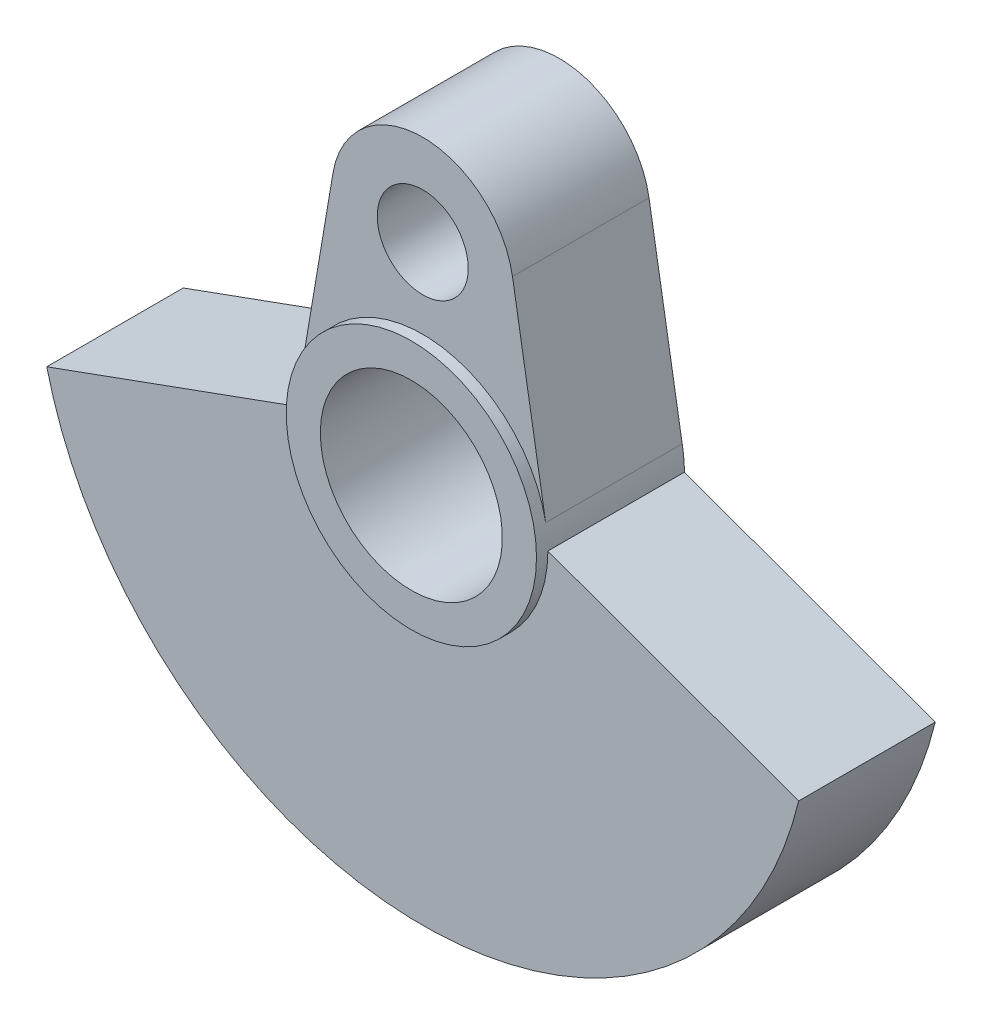
ISO-10303-21;
HEADER;
FILE_DESCRIPTION(('STEP AP214'),'2;1');
FILE_NAME('part.step','',(''),(''),'','','');
FILE_SCHEMA(('AUTOMOTIVE_DESIGN { 1 0 10303 214 1 1 1 1 }'));
ENDSEC;
DATA;
#1=APPLICATION_CONTEXT('core data for automotive mechanical design processes');
#2=APPLICATION_PROTOCOL_DEFINITION('international standard','automotive_design',2000,#1);
#3=PRODUCT_CONTEXT('',#1,'mechanical');
#4=PRODUCT('Part','Part','',(#3));
#5=PRODUCT_RELATED_PRODUCT_CATEGORY('part','',(#4));
#6=PRODUCT_DEFINITION_FORMATION('','',#4);
#7=PRODUCT_DEFINITION_CONTEXT('part definition',#1,'design');
#8=PRODUCT_DEFINITION('design','',#6,#7);
#9=PRODUCT_DEFINITION_SHAPE('','',#8);
#10=(LENGTH_UNIT() NAMED_UNIT(*) SI_UNIT(.MILLI.,.METRE.));
#11=(NAMED_UNIT(*) PLANE_ANGLE_UNIT() SI_UNIT($,.RADIAN.));
#12=(NAMED_UNIT(*) SI_UNIT($,.STERADIAN.) SOLID_ANGLE_UNIT());
#13=UNCERTAINTY_MEASURE_WITH_UNIT(LENGTH_MEASURE(1.E-05),#10,'distance_accuracy_value','');
#14=(GEOMETRIC_REPRESENTATION_CONTEXT(3) GLOBAL_UNCERTAINTY_ASSIGNED_CONTEXT((#13)) GLOBAL_UNIT_ASSIGNED_CONTEXT((#10,
#11,#12)) REPRESENTATION_CONTEXT('',''));
#15=CARTESIAN_POINT('',(0.,0.,0.));
#16=DIRECTION('',(0.,0.,1.));
#17=DIRECTION('',(1.,0.,0.));
#18=AXIS2_PLACEMENT_3D('',#15,#16,#17);
#19=CARTESIAN_POINT('',(2.91143017976683E-05,2.92052455162969,4.48682204607331));
#20=DIRECTION('',(0.,0.,-1.));
#21=DIRECTION('',(-1.,0.,0.));
#22=AXIS2_PLACEMENT_3D('',#19,#20,#21);
#23=CYLINDRICAL_SURFACE('',#22,25.5);
#24=CARTESIAN_POINT('',(2.91143017976683E-05,2.92052455162969,-4.51317795392669));
#25=DIRECTION('',(0.,0.,1.));
#26=DIRECTION('',(1.,0.,0.));
#27=AXIS2_PLACEMENT_3D('',#24,#25,#26);
#28=CIRCLE('',#27,25.5);
#29=CARTESIAN_POINT('',(24.7840965770893,-3.07947544837031,-4.51317795392669));
#30=VERTEX_POINT('',#29);
#31=CARTESIAN_POINT('',(-24.7840383484857,-3.07947544837031,-4.51317795392669));
#32=VERTEX_POINT('',#31);
#33=EDGE_CURVE('E158',#30,#32,#28,.F.);
#34=ORIENTED_EDGE('',*,*,#33,.F.);
#35=DIRECTION('',(0.,0.,-1.));
#36=VECTOR('',#35,1.);
#37=CARTESIAN_POINT('',(24.7840965770893,-3.07947544837031,4.48682204607331));
#38=LINE('',#37,#36);
#39=CARTESIAN_POINT('',(24.7840965770893,-3.07947544837031,4.48682204607331));
#40=VERTEX_POINT('',#39);
#41=EDGE_CURVE('E12',#40,#30,#38,.T.);
#42=ORIENTED_EDGE('',*,*,#41,.F.);
#43=CARTESIAN_POINT('',(2.91143017976683E-05,2.92052455162969,4.48682204607331));
#44=DIRECTION('',(0.,0.,1.));
#45=DIRECTION('',(1.,0.,0.));
#46=AXIS2_PLACEMENT_3D('',#43,#44,#45);
#47=CIRCLE('',#46,25.5);
#48=CARTESIAN_POINT('',(-24.7840383484857,-3.07947544837031,4.48682204607331));
#49=VERTEX_POINT('',#48);
#50=EDGE_CURVE('E161',#40,#49,#47,.F.);
#51=ORIENTED_EDGE('',*,*,#50,.T.);
#52=DIRECTION('',(0.,0.,-1.));
#53=VECTOR('',#52,1.);
#54=CARTESIAN_POINT('',(-24.7840383484857,-3.07947544837031,4.48682204607331));
#55=LINE('',#54,#53);
#56=EDGE_CURVE('E173',#49,#32,#55,.T.);
#57=ORIENTED_EDGE('',*,*,#56,.T.);
#58=EDGE_LOOP('',(#34,#42,#51,#57));
#59=FACE_BOUND('',#58,.T.);
#60=ADVANCED_FACE('F45',(#59),#23,.T.);
#61=CARTESIAN_POINT('',(0.960027913852562,5.56597203762425,4.48682204607331));
#62=DIRECTION('',(-0.341120932888379,-0.940019419557576,0.));
#63=DIRECTION('',(0.940019419557576,-0.341120932888379,0.));
#64=AXIS2_PLACEMENT_3D('',#61,#62,#63);
#65=PLANE('',#64);
#66=DIRECTION('',(-0.940019419557576,0.341120932888379,0.));
#67=VECTOR('',#66,1.);
#68=CARTESIAN_POINT('',(0.960027913852562,5.56597203762425,-4.51317795392669));
#69=LINE('',#68,#67);
#70=CARTESIAN_POINT('',(8.2500291143018,2.92052455162969,-4.51317795392669));
#71=VERTEX_POINT('',#70);
#72=EDGE_CURVE('E176',#30,#71,#69,.T.);
#73=ORIENTED_EDGE('',*,*,#72,.T.);
#74=DIRECTION('',(0.,0.,-1.));
#75=VECTOR('',#74,1.);
#76=CARTESIAN_POINT('',(8.2500291143018,2.92052455162969,4.48682204607331));
#77=LINE('',#76,#75);
#78=CARTESIAN_POINT('',(8.2500291143018,2.92052455162969,4.48682204607331));
#79=VERTEX_POINT('',#78);
#80=EDGE_CURVE('E52',#79,#71,#77,.T.);
#81=ORIENTED_EDGE('',*,*,#80,.F.);
#82=DIRECTION('',(-0.940019419557576,0.341120932888379,0.));
#83=VECTOR('',#82,1.);
#84=CARTESIAN_POINT('',(0.960027913852562,5.56597203762425,4.48682204607331));
#85=LINE('',#84,#83);
#86=EDGE_CURVE('E164',#40,#79,#85,.T.);
#87=ORIENTED_EDGE('',*,*,#86,.F.);
#88=ORIENTED_EDGE('',*,*,#41,.T.);
#89=EDGE_LOOP('',(#73,#81,#87,#88));
#90=FACE_BOUND('',#89,.T.);
#91=ADVANCED_FACE('F192',(#90),#65,.F.);
#92=CARTESIAN_POINT('',(-0.959969685248967,5.56597203762425,4.48682204607331));
#93=DIRECTION('',(-0.341120932888379,0.940019419557576,0.));
#94=DIRECTION('',(-0.940019419557576,-0.341120932888379,0.));
#95=AXIS2_PLACEMENT_3D('',#92,#93,#94);
#96=PLANE('',#95);
#97=DIRECTION('',(0.940019419557576,0.341120932888379,0.));
#98=VECTOR('',#97,1.);
#99=CARTESIAN_POINT('',(-0.959969685248967,5.56597203762425,-4.51317795392669));
#100=LINE('',#99,#98);
#101=CARTESIAN_POINT('',(-8.2499708856982,2.92052455162969,-4.51317795392669));
#102=VERTEX_POINT('',#101);
#103=EDGE_CURVE('E165',#32,#102,#100,.T.);
#104=ORIENTED_EDGE('',*,*,#103,.F.);
#105=ORIENTED_EDGE('',*,*,#56,.F.);
#106=DIRECTION('',(0.940019419557576,0.341120932888379,0.));
#107=VECTOR('',#106,1.);
#108=CARTESIAN_POINT('',(-0.959969685248967,5.56597203762425,4.48682204607331));
#109=LINE('',#108,#107);
#110=CARTESIAN_POINT('',(-8.2499708856982,2.92052455162969,4.48682204607331));
#111=VERTEX_POINT('',#110);
#112=EDGE_CURVE('E170',#49,#111,#109,.T.);
#113=ORIENTED_EDGE('',*,*,#112,.T.);
#114=DIRECTION('',(0.,0.,-1.));
#115=VECTOR('',#114,1.);
#116=CARTESIAN_POINT('',(-8.2499708856982,2.92052455162969,4.48682204607331));
#117=LINE('',#116,#115);
#118=EDGE_CURVE('E182',#111,#102,#117,.T.);
#119=ORIENTED_EDGE('',*,*,#118,.T.);
#120=EDGE_LOOP('',(#104,#105,#113,#119));
#121=FACE_BOUND('',#120,.T.);
#122=ADVANCED_FACE('F202',(#121),#96,.T.);
#123=CARTESIAN_POINT('',(2.91143017976683E-05,2.92052455162969,4.48682204607331));
#124=DIRECTION('',(0.,0.,1.));
#125=DIRECTION('',(1.,0.,0.));
#126=AXIS2_PLACEMENT_3D('',#123,#124,#125);
#127=PLANE('',#126);
#128=ORIENTED_EDGE('',*,*,#50,.F.);
#129=ORIENTED_EDGE('',*,*,#86,.T.);
#130=CARTESIAN_POINT('',(2.91143017976683E-05,2.92052455162969,4.48682204607331));
#131=DIRECTION('',(0.,0.,1.));
#132=DIRECTION('',(1.,0.,0.));
#133=AXIS2_PLACEMENT_3D('',#130,#131,#132);
#134=CIRCLE('',#133,8.25);
#135=EDGE_CURVE('E168',#111,#79,#134,.T.);
#136=ORIENTED_EDGE('',*,*,#135,.F.);
#137=ORIENTED_EDGE('',*,*,#112,.F.);
#138=EDGE_LOOP('',(#128,#129,#136,#137));
#139=FACE_BOUND('',#138,.T.);
#140=ADVANCED_FACE('F224',(#139),#127,.T.);
#141=CARTESIAN_POINT('',(2.91143017976683E-05,2.92052455162969,-4.51317795392669));
#142=DIRECTION('',(0.,0.,1.));
#143=DIRECTION('',(1.,0.,0.));
#144=AXIS2_PLACEMENT_3D('',#141,#142,#143);
#145=PLANE('',#144);
#146=ORIENTED_EDGE('',*,*,#33,.T.);
#147=ORIENTED_EDGE('',*,*,#103,.T.);
#148=CARTESIAN_POINT('',(2.91143017976683E-05,2.92052455162969,-4.51317795392669));
#149=DIRECTION('',(0.,0.,1.));
#150=DIRECTION('',(1.,0.,0.));
#151=AXIS2_PLACEMENT_3D('',#148,#149,#150);
#152=CIRCLE('',#151,8.25);
#153=CARTESIAN_POINT('',(-8.13458058746017,4.2955245516297,-4.51317795392669));
#154=VERTEX_POINT('',#153);
#155=EDGE_CURVE('E152',#154,#102,#152,.T.);
#156=ORIENTED_EDGE('',*,*,#155,.F.);
#157=DIRECTION('',(-0.166666666666667,-0.986013297183269,0.));
#158=VECTOR('',#157,1.);
#159=CARTESIAN_POINT('',(-8.13458058746017,4.2955245516297,-4.51317795392669));
#160=LINE('',#159,#158);
#161=CARTESIAN_POINT('',(-5.91605066879782,17.4205245516297,-4.51317795392669));
#162=VERTEX_POINT('',#161);
#163=EDGE_CURVE('E132',#162,#154,#160,.T.);
#164=ORIENTED_EDGE('',*,*,#163,.F.);
#165=CARTESIAN_POINT('',(2.91143018030489E-05,16.4205245516297,-4.51317795392669));
#166=DIRECTION('',(0.,0.,1.));
#167=DIRECTION('',(1.,0.,0.));
#168=AXIS2_PLACEMENT_3D('',#165,#166,#167);
#169=CIRCLE('',#168,6.);
#170=CARTESIAN_POINT('',(5.91624954479313,17.4196921140721,-4.51317795392669));
#171=VERTEX_POINT('',#170);
#172=EDGE_CURVE('E141',#171,#162,#169,.T.);
#173=ORIENTED_EDGE('',*,*,#172,.F.);
#174=DIRECTION('',(0.166527927073735,-0.98603673841522,0.));
#175=VECTOR('',#174,1.);
#176=CARTESIAN_POINT('',(8.13298537469537,4.29406804576102,-4.51317795392669));
#177=LINE('',#176,#175);
#178=CARTESIAN_POINT('',(8.10371208776362,4.4673995516297,-4.51317795392669));
#179=VERTEX_POINT('',#178);
#180=EDGE_CURVE('E113',#171,#179,#177,.T.);
#181=ORIENTED_EDGE('',*,*,#180,.T.);
#182=EDGE_CURVE('E159',#71,#179,#152,.T.);
#183=ORIENTED_EDGE('',*,*,#182,.F.);
#184=ORIENTED_EDGE('',*,*,#72,.F.);
#185=EDGE_LOOP('',(#146,#147,#156,#164,#173,#181,#183,#184));
#186=FACE_BOUND('',#185,.T.);
#187=CARTESIAN_POINT('',(2.91143017976683E-05,2.92052455162969,-4.51317795392669));
#188=DIRECTION('',(0.,0.,1.));
#189=DIRECTION('',(1.,0.,0.));
#190=AXIS2_PLACEMENT_3D('',#187,#188,#189);
#191=CIRCLE('',#190,6.);
#192=CARTESIAN_POINT('',(-5.9999708856982,2.92052455162969,-4.51317795392669));
#193=VERTEX_POINT('',#192);
#194=EDGE_CURVE('E117',#193,#193,#191,.T.);
#195=ORIENTED_EDGE('',*,*,#194,.T.);
#196=EDGE_LOOP('',(#195));
#197=FACE_BOUND('',#196,.T.);
#198=CARTESIAN_POINT('',(2.91143018030489E-05,16.4205245516297,-4.51317795392669));
#199=DIRECTION('',(0.,0.,1.));
#200=DIRECTION('',(1.,0.,0.));
#201=AXIS2_PLACEMENT_3D('',#198,#199,#200);
#202=CIRCLE('',#201,3.);
#203=CARTESIAN_POINT('',(3.0000291143018,16.4205245516297,-4.51317795392669));
#204=VERTEX_POINT('',#203);
#205=EDGE_CURVE('E137',#204,#204,#202,.T.);
#206=ORIENTED_EDGE('',*,*,#205,.T.);
#207=EDGE_LOOP('',(#206));
#208=FACE_BOUND('',#207,.T.);
#209=ADVANCED_FACE('F195',(#186,#197,#208),#145,.F.);
#210=CARTESIAN_POINT('',(2.91143017976683E-05,2.92052455162969,5.23682204607331));
#211=DIRECTION('',(0.,0.,-1.));
#212=DIRECTION('',(-1.,0.,0.));
#213=AXIS2_PLACEMENT_3D('',#210,#211,#212);
#214=CYLINDRICAL_SURFACE('',#213,8.25);
#215=ORIENTED_EDGE('',*,*,#182,.T.);
#216=DIRECTION('',(0.,0.,-1.));
#217=VECTOR('',#216,1.);
#218=CARTESIAN_POINT('',(8.10371208776362,4.46739955162969,4.48682204607331));
#219=LINE('',#218,#217);
#220=CARTESIAN_POINT('',(8.10371208776362,4.4673995516297,4.48682204607331));
#221=VERTEX_POINT('',#220);
#222=EDGE_CURVE('E64',#221,#179,#219,.T.);
#223=ORIENTED_EDGE('',*,*,#222,.F.);
#224=CARTESIAN_POINT('',(2.91143017976683E-05,2.92052455162969,4.48682204607331));
#225=DIRECTION('',(0.,0.,1.));
#226=DIRECTION('',(1.,0.,0.));
#227=AXIS2_PLACEMENT_3D('',#224,#225,#226);
#228=CIRCLE('',#227,8.25);
#229=CARTESIAN_POINT('',(-8.13458058746018,4.2955245516297,4.48682204607331));
#230=VERTEX_POINT('',#229);
#231=EDGE_CURVE('E59',#221,#230,#228,.T.);
#232=ORIENTED_EDGE('',*,*,#231,.T.);
#233=DIRECTION('',(0.,0.,-1.));
#234=VECTOR('',#233,1.);
#235=CARTESIAN_POINT('',(-8.13458058746017,4.2955245516297,4.48682204607331));
#236=LINE('',#235,#234);
#237=EDGE_CURVE('E146',#230,#154,#236,.T.);
#238=ORIENTED_EDGE('',*,*,#237,.T.);
#239=ORIENTED_EDGE('',*,*,#155,.T.);
#240=ORIENTED_EDGE('',*,*,#118,.F.);
#241=ORIENTED_EDGE('',*,*,#135,.T.);
#242=ORIENTED_EDGE('',*,*,#80,.T.);
#243=EDGE_LOOP('',(#215,#223,#232,#238,#239,#240,#241,#242));
#244=FACE_BOUND('',#243,.T.);
#245=CARTESIAN_POINT('',(2.91143017976683E-05,2.92052455162969,5.23682204607331));
#246=DIRECTION('',(0.,0.,1.));
#247=DIRECTION('',(1.,0.,0.));
#248=AXIS2_PLACEMENT_3D('',#245,#246,#247);
#249=CIRCLE('',#248,8.25);
#250=CARTESIAN_POINT('',(8.2500291143018,2.92052455162969,5.23682204607331));
#251=VERTEX_POINT('',#250);
#252=EDGE_CURVE('E155',#251,#251,#249,.T.);
#253=ORIENTED_EDGE('',*,*,#252,.F.);
#254=EDGE_LOOP('',(#253));
#255=FACE_BOUND('',#254,.T.);
#256=ADVANCED_FACE('F186',(#244,#255),#214,.T.);
#257=CARTESIAN_POINT('',(2.91143017976683E-05,2.92052455162969,5.23682204607331));
#258=DIRECTION('',(0.,0.,1.));
#259=DIRECTION('',(1.,0.,0.));
#260=AXIS2_PLACEMENT_3D('',#257,#258,#259);
#261=PLANE('',#260);
#262=ORIENTED_EDGE('',*,*,#252,.T.);
#263=EDGE_LOOP('',(#262));
#264=FACE_BOUND('',#263,.T.);
#265=CARTESIAN_POINT('',(2.91143017976683E-05,2.92052455162969,5.23682204607331));
#266=DIRECTION('',(0.,0.,1.));
#267=DIRECTION('',(1.,0.,0.));
#268=AXIS2_PLACEMENT_3D('',#265,#266,#267);
#269=CIRCLE('',#268,6.);
#270=CARTESIAN_POINT('',(-5.9999708856982,2.92052455162969,5.23682204607331));
#271=VERTEX_POINT('',#270);
#272=EDGE_CURVE('E149',#271,#271,#269,.T.);
#273=ORIENTED_EDGE('',*,*,#272,.F.);
#274=EDGE_LOOP('',(#273));
#275=FACE_BOUND('',#274,.T.);
#276=ADVANCED_FACE('F234',(#264,#275),#261,.T.);
#277=CARTESIAN_POINT('',(2.91143017976683E-05,2.92052455162969,5.23682204607331));
#278=DIRECTION('',(0.,0.,-1.));
#279=DIRECTION('',(-1.,0.,0.));
#280=AXIS2_PLACEMENT_3D('',#277,#278,#279);
#281=CYLINDRICAL_SURFACE('',#280,6.);
#282=CARTESIAN_POINT('',(-5.9999708856982,2.92052455162969,5.23682204607331));
#283=CARTESIAN_POINT('',(-5.9999708856982,2.92052455162969,5.13525954607331));
#284=CARTESIAN_POINT('',(-5.9999708856982,2.92052455162969,5.03369704607331));
#285=CARTESIAN_POINT('',(-5.9999708856982,2.92052455162969,4.83057204607331));
#286=CARTESIAN_POINT('',(-5.9999708856982,2.92052455162969,4.72900954607331));
#287=CARTESIAN_POINT('',(-5.9999708856982,2.92052455162969,4.52588454607331));
#288=CARTESIAN_POINT('',(-5.9999708856982,2.92052455162969,4.42432204607331));
#289=CARTESIAN_POINT('',(-5.9999708856982,2.92052455162969,4.22119704607331));
#290=CARTESIAN_POINT('',(-5.9999708856982,2.92052455162969,4.11963454607331));
#291=CARTESIAN_POINT('',(-5.9999708856982,2.92052455162969,3.91650954607331));
#292=CARTESIAN_POINT('',(-5.9999708856982,2.92052455162969,3.81494704607331));
#293=CARTESIAN_POINT('',(-5.9999708856982,2.92052455162969,3.61182204607331));
#294=CARTESIAN_POINT('',(-5.9999708856982,2.92052455162969,3.51025954607331));
#295=CARTESIAN_POINT('',(-5.9999708856982,2.92052455162969,3.30713454607331));
#296=CARTESIAN_POINT('',(-5.9999708856982,2.92052455162969,3.20557204607331));
#297=CARTESIAN_POINT('',(-5.9999708856982,2.92052455162969,3.00244704607331));
#298=CARTESIAN_POINT('',(-5.9999708856982,2.92052455162969,2.90088454607331));
#299=CARTESIAN_POINT('',(-5.9999708856982,2.92052455162969,2.69775954607331));
#300=CARTESIAN_POINT('',(-5.9999708856982,2.92052455162969,2.59619704607331));
#301=CARTESIAN_POINT('',(-5.9999708856982,2.92052455162969,2.39307204607331));
#302=CARTESIAN_POINT('',(-5.9999708856982,2.92052455162969,2.29150954607331));
#303=CARTESIAN_POINT('',(-5.9999708856982,2.92052455162969,2.08838454607331));
#304=CARTESIAN_POINT('',(-5.9999708856982,2.92052455162969,1.98682204607331));
#305=CARTESIAN_POINT('',(-5.9999708856982,2.92052455162969,1.78369704607331));
#306=CARTESIAN_POINT('',(-5.9999708856982,2.92052455162969,1.68213454607331));
#307=CARTESIAN_POINT('',(-5.9999708856982,2.92052455162969,1.47900954607331));
#308=CARTESIAN_POINT('',(-5.9999708856982,2.92052455162969,1.37744704607331));
#309=CARTESIAN_POINT('',(-5.9999708856982,2.92052455162969,1.17432204607331));
#310=CARTESIAN_POINT('',(-5.9999708856982,2.92052455162969,1.07275954607331));
#311=CARTESIAN_POINT('',(-5.9999708856982,2.92052455162969,0.869634546073313));
#312=CARTESIAN_POINT('',(-5.9999708856982,2.92052455162969,0.768072046073313));
#313=CARTESIAN_POINT('',(-5.9999708856982,2.92052455162969,0.564947046073313));
#314=CARTESIAN_POINT('',(-5.9999708856982,2.92052455162969,0.463384546073313));
#315=CARTESIAN_POINT('',(-5.9999708856982,2.92052455162969,0.260259546073313));
#316=CARTESIAN_POINT('',(-5.9999708856982,2.92052455162969,0.158697046073313));
#317=CARTESIAN_POINT('',(-5.9999708856982,2.92052455162969,-0.0444279539266873));
#318=CARTESIAN_POINT('',(-5.9999708856982,2.92052455162969,-0.145990453926687));
#319=CARTESIAN_POINT('',(-5.9999708856982,2.92052455162969,-0.349115453926687));
#320=CARTESIAN_POINT('',(-5.9999708856982,2.92052455162969,-0.450677953926687));
#321=CARTESIAN_POINT('',(-5.9999708856982,2.92052455162969,-0.653802953926687));
#322=CARTESIAN_POINT('',(-5.9999708856982,2.92052455162969,-0.755365453926687));
#323=CARTESIAN_POINT('',(-5.9999708856982,2.92052455162969,-0.958490453926687));
#324=CARTESIAN_POINT('',(-5.9999708856982,2.92052455162969,-1.06005295392669));
#325=CARTESIAN_POINT('',(-5.9999708856982,2.92052455162969,-1.26317795392669));
#326=CARTESIAN_POINT('',(-5.9999708856982,2.92052455162969,-1.36474045392669));
#327=CARTESIAN_POINT('',(-5.9999708856982,2.92052455162969,-1.56786545392669));
#328=CARTESIAN_POINT('',(-5.9999708856982,2.92052455162969,-1.66942795392669));
#329=CARTESIAN_POINT('',(-5.9999708856982,2.92052455162969,-1.87255295392669));
#330=CARTESIAN_POINT('',(-5.9999708856982,2.92052455162969,-1.97411545392669));
#331=CARTESIAN_POINT('',(-5.9999708856982,2.92052455162969,-2.17724045392669));
#332=CARTESIAN_POINT('',(-5.9999708856982,2.92052455162969,-2.27880295392669));
#333=CARTESIAN_POINT('',(-5.9999708856982,2.92052455162969,-2.48192795392669));
#334=CARTESIAN_POINT('',(-5.9999708856982,2.92052455162969,-2.58349045392669));
#335=CARTESIAN_POINT('',(-5.9999708856982,2.92052455162969,-2.78661545392669));
#336=CARTESIAN_POINT('',(-5.9999708856982,2.92052455162969,-2.88817795392669));
#337=CARTESIAN_POINT('',(-5.9999708856982,2.92052455162969,-3.09130295392669));
#338=CARTESIAN_POINT('',(-5.9999708856982,2.92052455162969,-3.19286545392669));
#339=CARTESIAN_POINT('',(-5.9999708856982,2.92052455162969,-3.39599045392669));
#340=CARTESIAN_POINT('',(-5.9999708856982,2.92052455162969,-3.49755295392669));
#341=CARTESIAN_POINT('',(-5.9999708856982,2.92052455162969,-3.70067795392669));
#342=CARTESIAN_POINT('',(-5.9999708856982,2.92052455162969,-3.80224045392669));
#343=CARTESIAN_POINT('',(-5.9999708856982,2.92052455162969,-4.00536545392669));
#344=CARTESIAN_POINT('',(-5.9999708856982,2.92052455162969,-4.10692795392669));
#345=CARTESIAN_POINT('',(-5.9999708856982,2.92052455162969,-4.31005295392669));
#346=CARTESIAN_POINT('',(-5.9999708856982,2.92052455162969,-4.41161545392669));
#347=CARTESIAN_POINT('',(-5.9999708856982,2.92052455162969,-4.51317795392669));
#348=B_SPLINE_CURVE_WITH_KNOTS('',3,(#282,#283,#284,#285,#286,#287,#288,#289,#290,#291,#292,
#293,#294,#295,#296,#297,#298,#299,#300,#301,#302,#303,#304,#305,#306,#307,#308,#309,#310,#311,
#312,#313,#314,#315,#316,#317,#318,#319,#320,#321,#322,#323,#324,#325,#326,#327,#328,#329,#330,
#331,#332,#333,#334,#335,#336,#337,#338,#339,#340,#341,#342,#343,#344,#345,#346,#347),
.UNSPECIFIED.,.F.,.F.,(4,2,2,2,2,2,2,2,2,2,2,2,2,2,2,2,2,2,2,2,2,2,2,2,2,2,2,2,2,2,2,2,4),(0.,
0.3046875,0.609375000000001,0.914062500000001,1.21875,1.5234375,1.828125,2.1328125,2.4375,
2.7421875,3.046875,3.3515625,3.65625,3.9609375,4.265625,4.5703125,4.875,5.1796875,5.484375,
5.7890625,6.09375,6.3984375,6.703125,7.0078125,7.3125,7.6171875,7.921875,8.2265625,8.53125,
8.8359375,9.140625,9.4453125,9.75),.UNSPECIFIED.);
#349=EDGE_CURVE('BSEAM237',#271,#193,#348,.T.);
#350=ORIENTED_EDGE('',*,*,#272,.T.);
#351=ORIENTED_EDGE('',*,*,#194,.F.);
#352=ORIENTED_EDGE('',*,*,#349,.T.);
#353=ORIENTED_EDGE('',*,*,#349,.F.);
#354=EDGE_LOOP('',(#350,#352,#351,#353));
#355=FACE_BOUND('',#354,.T.);
#356=ADVANCED_FACE('F237',(#355),#281,.F.);
#357=CARTESIAN_POINT('',(8.13298537469537,4.29406804576102,4.48682204607331));
#358=DIRECTION('',(0.98603673841522,0.166527927073735,0.));
#359=DIRECTION('',(-0.166527927073735,0.98603673841522,0.));
#360=AXIS2_PLACEMENT_3D('',#357,#358,#359);
#361=PLANE('',#360);
#362=ORIENTED_EDGE('',*,*,#180,.F.);
#363=DIRECTION('',(0.,0.,-1.));
#364=VECTOR('',#363,1.);
#365=CARTESIAN_POINT('',(5.91624954479313,17.4196921140721,4.48682204607331));
#366=LINE('',#365,#364);
#367=CARTESIAN_POINT('',(5.91624954479313,17.4196921140721,4.48682204607331));
#368=VERTEX_POINT('',#367);
#369=EDGE_CURVE('E107',#368,#171,#366,.T.);
#370=ORIENTED_EDGE('',*,*,#369,.F.);
#371=DIRECTION('',(0.166527927073735,-0.98603673841522,0.));
#372=VECTOR('',#371,1.);
#373=CARTESIAN_POINT('',(8.13298537469537,4.29406804576102,4.48682204607331));
#374=LINE('',#373,#372);
#375=EDGE_CURVE('E111',#368,#221,#374,.T.);
#376=ORIENTED_EDGE('',*,*,#375,.T.);
#377=ORIENTED_EDGE('',*,*,#222,.T.);
#378=EDGE_LOOP('',(#362,#370,#376,#377));
#379=FACE_BOUND('',#378,.T.);
#380=ADVANCED_FACE('F109',(#379),#361,.T.);
#381=CARTESIAN_POINT('',(2.91143018030489E-05,16.4205245516297,4.48682204607331));
#382=DIRECTION('',(0.,0.,-1.));
#383=DIRECTION('',(-1.,0.,0.));
#384=AXIS2_PLACEMENT_3D('',#381,#382,#383);
#385=CYLINDRICAL_SURFACE('',#384,6.);
#386=ORIENTED_EDGE('',*,*,#172,.T.);
#387=DIRECTION('',(0.,0.,-1.));
#388=VECTOR('',#387,1.);
#389=CARTESIAN_POINT('',(-5.91605066879782,17.4205245516297,4.48682204607331));
#390=LINE('',#389,#388);
#391=CARTESIAN_POINT('',(-5.91605066879782,17.4205245516297,4.48682204607331));
#392=VERTEX_POINT('',#391);
#393=EDGE_CURVE('E118',#392,#162,#390,.T.);
#394=ORIENTED_EDGE('',*,*,#393,.F.);
#395=CARTESIAN_POINT('',(2.91143018030489E-05,16.4205245516297,4.48682204607331));
#396=DIRECTION('',(0.,0.,1.));
#397=DIRECTION('',(1.,0.,0.));
#398=AXIS2_PLACEMENT_3D('',#395,#396,#397);
#399=CIRCLE('',#398,6.);
#400=EDGE_CURVE('E122',#368,#392,#399,.T.);
#401=ORIENTED_EDGE('',*,*,#400,.F.);
#402=ORIENTED_EDGE('',*,*,#369,.T.);
#403=EDGE_LOOP('',(#386,#394,#401,#402));
#404=FACE_BOUND('',#403,.T.);
#405=ADVANCED_FACE('F123',(#404),#385,.T.);
#406=CARTESIAN_POINT('',(-8.13458058746017,4.2955245516297,4.48682204607331));
#407=DIRECTION('',(0.986013297183269,-0.166666666666667,0.));
#408=DIRECTION('',(0.166666666666667,0.986013297183269,0.));
#409=AXIS2_PLACEMENT_3D('',#406,#407,#408);
#410=PLANE('',#409);
#411=ORIENTED_EDGE('',*,*,#163,.T.);
#412=ORIENTED_EDGE('',*,*,#237,.F.);
#413=DIRECTION('',(-0.166666666666667,-0.986013297183269,0.));
#414=VECTOR('',#413,1.);
#415=CARTESIAN_POINT('',(-8.13458058746017,4.2955245516297,4.48682204607331));
#416=LINE('',#415,#414);
#417=EDGE_CURVE('E126',#392,#230,#416,.T.);
#418=ORIENTED_EDGE('',*,*,#417,.F.);
#419=ORIENTED_EDGE('',*,*,#393,.T.);
#420=EDGE_LOOP('',(#411,#412,#418,#419));
#421=FACE_BOUND('',#420,.T.);
#422=ADVANCED_FACE('F205',(#421),#410,.F.);
#423=CARTESIAN_POINT('',(2.91143018030489E-05,16.4205245516297,4.48682204607331));
#424=DIRECTION('',(0.,0.,-1.));
#425=DIRECTION('',(-1.,0.,0.));
#426=AXIS2_PLACEMENT_3D('',#423,#424,#425);
#427=CYLINDRICAL_SURFACE('',#426,3.);
#428=CARTESIAN_POINT('',(2.91143018030489E-05,16.4205245516297,4.48682204607331));
#429=DIRECTION('',(0.,0.,1.));
#430=DIRECTION('',(1.,0.,0.));
#431=AXIS2_PLACEMENT_3D('',#428,#429,#430);
#432=CIRCLE('',#431,3.);
#433=CARTESIAN_POINT('',(3.0000291143018,16.4205245516297,4.48682204607331));
#434=VERTEX_POINT('',#433);
#435=EDGE_CURVE('E129',#434,#434,#432,.T.);
#436=ORIENTED_EDGE('',*,*,#435,.T.);
#437=EDGE_LOOP('',(#436));
#438=FACE_BOUND('',#437,.T.);
#439=ORIENTED_EDGE('',*,*,#205,.F.);
#440=EDGE_LOOP('',(#439));
#441=FACE_BOUND('',#440,.T.);
#442=ADVANCED_FACE('F207',(#438,#441),#427,.F.);
#443=CARTESIAN_POINT('',(2.91143017976683E-05,2.92052455162969,4.48682204607331));
#444=DIRECTION('',(0.,0.,1.));
#445=DIRECTION('',(1.,0.,0.));
#446=AXIS2_PLACEMENT_3D('',#443,#444,#445);
#447=PLANE('',#446);
#448=ORIENTED_EDGE('',*,*,#435,.F.);
#449=EDGE_LOOP('',(#448));
#450=FACE_BOUND('',#449,.T.);
#451=ORIENTED_EDGE('',*,*,#375,.F.);
#452=ORIENTED_EDGE('',*,*,#400,.T.);
#453=ORIENTED_EDGE('',*,*,#417,.T.);
#454=ORIENTED_EDGE('',*,*,#231,.F.);
#455=EDGE_LOOP('',(#451,#452,#453,#454));
#456=FACE_BOUND('',#455,.T.);
#457=ADVANCED_FACE('F128',(#450,#456),#447,.T.);
#458=CLOSED_SHELL('',(#60,#91,#122,#140,#209,#256,#276,#356,#380,#405,#422,#442,#457));
#459=MANIFOLD_SOLID_BREP('B2',#458);
#460=ADVANCED_BREP_SHAPE_REPRESENTATION('',(#18,#459),#14);
#461=SHAPE_DEFINITION_REPRESENTATION(#9,#460);
ENDSEC;
END-ISO-10303-21;
